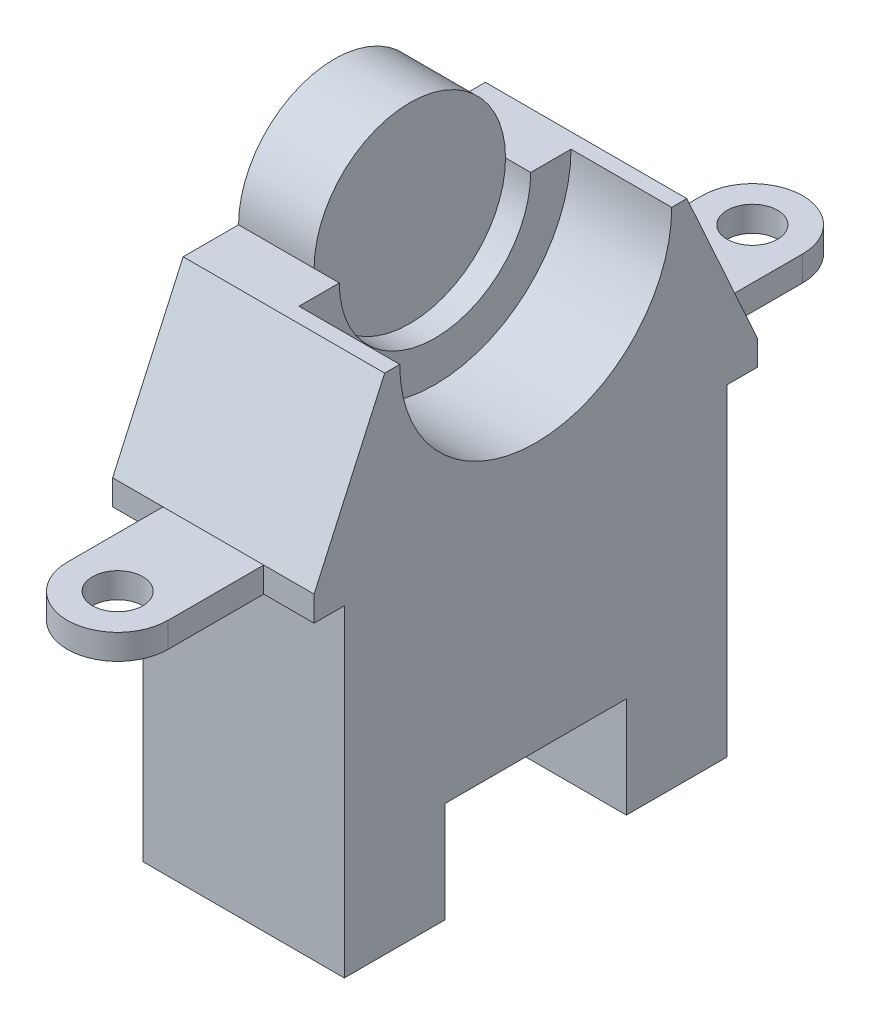
ISO-10303-21;
HEADER;
FILE_DESCRIPTION(('STEP AP214'),'2;1');
FILE_NAME('part.step','',(''),(''),'','','');
FILE_SCHEMA(('AUTOMOTIVE_DESIGN { 1 0 10303 214 1 1 1 1 }'));
ENDSEC;
DATA;
#1=APPLICATION_CONTEXT('core data for automotive mechanical design processes');
#2=APPLICATION_PROTOCOL_DEFINITION('international standard','automotive_design',2000,#1);
#3=PRODUCT_CONTEXT('',#1,'mechanical');
#4=PRODUCT('Part','Part','',(#3));
#5=PRODUCT_RELATED_PRODUCT_CATEGORY('part','',(#4));
#6=PRODUCT_DEFINITION_FORMATION('','',#4);
#7=PRODUCT_DEFINITION_CONTEXT('part definition',#1,'design');
#8=PRODUCT_DEFINITION('design','',#6,#7);
#9=PRODUCT_DEFINITION_SHAPE('','',#8);
#10=(LENGTH_UNIT() NAMED_UNIT(*) SI_UNIT(.MILLI.,.METRE.));
#11=(NAMED_UNIT(*) PLANE_ANGLE_UNIT() SI_UNIT($,.RADIAN.));
#12=(NAMED_UNIT(*) SI_UNIT($,.STERADIAN.) SOLID_ANGLE_UNIT());
#13=UNCERTAINTY_MEASURE_WITH_UNIT(LENGTH_MEASURE(1.E-05),#10,'distance_accuracy_value','');
#14=(GEOMETRIC_REPRESENTATION_CONTEXT(3) GLOBAL_UNCERTAINTY_ASSIGNED_CONTEXT((#13)) GLOBAL_UNIT_ASSIGNED_CONTEXT((#10,
#11,#12)) REPRESENTATION_CONTEXT('',''));
#15=CARTESIAN_POINT('',(0.,0.,0.));
#16=DIRECTION('',(0.,0.,1.));
#17=DIRECTION('',(1.,0.,0.));
#18=AXIS2_PLACEMENT_3D('',#15,#16,#17);
#19=CARTESIAN_POINT('',(20.,64.,44.));
#20=DIRECTION('',(0.,0.,-1.));
#21=DIRECTION('',(-1.,0.,0.));
#22=AXIS2_PLACEMENT_3D('',#19,#20,#21);
#23=PLANE('',#22);
#24=DIRECTION('',(0.,1.,0.));
#25=VECTOR('',#24,1.);
#26=CARTESIAN_POINT('',(10.,28.7721700923829,44.));
#27=LINE('',#26,#25);
#28=CARTESIAN_POINT('',(10.,64.,44.));
#29=VERTEX_POINT('',#28);
#30=CARTESIAN_POINT('',(10.,69.,44.));
#31=VERTEX_POINT('',#30);
#32=EDGE_CURVE('E761',#29,#31,#27,.T.);
#33=ORIENTED_EDGE('',*,*,#32,.F.);
#34=DIRECTION('',(-1.,0.,0.));
#35=VECTOR('',#34,1.);
#36=CARTESIAN_POINT('',(20.,64.,44.));
#37=LINE('',#36,#35);
#38=CARTESIAN_POINT('',(20.,64.,44.));
#39=VERTEX_POINT('',#38);
#40=EDGE_CURVE('E254',#39,#29,#37,.T.);
#41=ORIENTED_EDGE('',*,*,#40,.F.);
#42=DIRECTION('',(0.,-1.,0.));
#43=VECTOR('',#42,1.);
#44=CARTESIAN_POINT('',(20.,64.,44.));
#45=LINE('',#44,#43);
#46=CARTESIAN_POINT('',(20.,69.,44.));
#47=VERTEX_POINT('',#46);
#48=EDGE_CURVE('E400',#47,#39,#45,.T.);
#49=ORIENTED_EDGE('',*,*,#48,.F.);
#50=DIRECTION('',(-1.,0.,0.));
#51=VECTOR('',#50,1.);
#52=CARTESIAN_POINT('',(20.,69.,44.));
#53=LINE('',#52,#51);
#54=EDGE_CURVE('E266',#47,#31,#53,.T.);
#55=ORIENTED_EDGE('',*,*,#54,.T.);
#56=EDGE_LOOP('',(#33,#41,#49,#55));
#57=FACE_BOUND('',#56,.T.);
#58=ADVANCED_FACE('F45',(#57),#23,.F.);
#59=CARTESIAN_POINT('',(20.,64.,-44.));
#60=DIRECTION('',(0.,0.,1.));
#61=DIRECTION('',(1.,0.,0.));
#62=AXIS2_PLACEMENT_3D('',#59,#60,#61);
#63=PLANE('',#62);
#64=DIRECTION('',(0.,1.,0.));
#65=VECTOR('',#64,1.);
#66=CARTESIAN_POINT('',(-9.99999999999999,28.7721700923829,-44.));
#67=LINE('',#66,#65);
#68=CARTESIAN_POINT('',(-9.99999999999999,64.,-44.));
#69=VERTEX_POINT('',#68);
#70=CARTESIAN_POINT('',(-9.99999999999999,69.,-44.));
#71=VERTEX_POINT('',#70);
#72=EDGE_CURVE('E69',#69,#71,#67,.T.);
#73=ORIENTED_EDGE('',*,*,#72,.F.);
#74=DIRECTION('',(-1.,0.,0.));
#75=VECTOR('',#74,1.);
#76=CARTESIAN_POINT('',(20.,64.,-44.));
#77=LINE('',#76,#75);
#78=CARTESIAN_POINT('',(-20.,64.,-44.));
#79=VERTEX_POINT('',#78);
#80=EDGE_CURVE('E283',#69,#79,#77,.T.);
#81=ORIENTED_EDGE('',*,*,#80,.T.);
#82=DIRECTION('',(0.,1.,0.));
#83=VECTOR('',#82,1.);
#84=CARTESIAN_POINT('',(-20.,64.,-44.));
#85=LINE('',#84,#83);
#86=CARTESIAN_POINT('',(-20.,69.,-44.));
#87=VERTEX_POINT('',#86);
#88=EDGE_CURVE('E431',#79,#87,#85,.T.);
#89=ORIENTED_EDGE('',*,*,#88,.T.);
#90=DIRECTION('',(-1.,0.,0.));
#91=VECTOR('',#90,1.);
#92=CARTESIAN_POINT('',(20.,69.,-44.));
#93=LINE('',#92,#91);
#94=EDGE_CURVE('E278',#71,#87,#93,.T.);
#95=ORIENTED_EDGE('',*,*,#94,.F.);
#96=EDGE_LOOP('',(#73,#81,#89,#95));
#97=FACE_BOUND('',#96,.T.);
#98=ADVANCED_FACE('F504',(#97),#63,.F.);
#99=CARTESIAN_POINT('',(20.,100.,0.));
#100=DIRECTION('',(1.,0.,0.));
#101=DIRECTION('',(0.,0.,-1.));
#102=AXIS2_PLACEMENT_3D('',#99,#100,#101);
#103=CYLINDRICAL_SURFACE('',#102,19.);
#104=CARTESIAN_POINT('',(-5.,100.,0.));
#105=DIRECTION('',(-1.,0.,0.));
#106=DIRECTION('',(0.,0.,1.));
#107=AXIS2_PLACEMENT_3D('',#104,#105,#106);
#108=CIRCLE('',#107,19.);
#109=CARTESIAN_POINT('',(-5.,100.,19.));
#110=VERTEX_POINT('',#109);
#111=CARTESIAN_POINT('',(-5.,100.,-19.));
#112=VERTEX_POINT('',#111);
#113=EDGE_CURVE('E11',#110,#112,#108,.F.);
#114=ORIENTED_EDGE('',*,*,#113,.F.);
#115=DIRECTION('',(1.,0.,0.));
#116=VECTOR('',#115,1.);
#117=CARTESIAN_POINT('',(20.,100.,19.));
#118=LINE('',#117,#116);
#119=CARTESIAN_POINT('',(0.,100.,19.));
#120=VERTEX_POINT('',#119);
#121=EDGE_CURVE('E315',#120,#110,#118,.F.);
#122=ORIENTED_EDGE('',*,*,#121,.F.);
#123=CARTESIAN_POINT('',(0.,100.,0.));
#124=DIRECTION('',(1.,0.,0.));
#125=DIRECTION('',(0.,0.,-1.));
#126=AXIS2_PLACEMENT_3D('',#123,#124,#125);
#127=CIRCLE('',#126,19.);
#128=CARTESIAN_POINT('',(0.,100.,-19.));
#129=VERTEX_POINT('',#128);
#130=EDGE_CURVE('E344',#120,#129,#127,.T.);
#131=ORIENTED_EDGE('',*,*,#130,.T.);
#132=DIRECTION('',(1.,0.,0.));
#133=VECTOR('',#132,1.);
#134=CARTESIAN_POINT('',(20.,100.,-19.));
#135=LINE('',#134,#133);
#136=EDGE_CURVE('E325',#112,#129,#135,.T.);
#137=ORIENTED_EDGE('',*,*,#136,.F.);
#138=EDGE_LOOP('',(#114,#122,#131,#137));
#139=FACE_BOUND('',#138,.T.);
#140=ADVANCED_FACE('F349',(#139),#103,.F.);
#141=CARTESIAN_POINT('',(20.,100.,30.));
#142=DIRECTION('',(0.,-1.,0.));
#143=DIRECTION('',(0.,0.,-1.));
#144=AXIS2_PLACEMENT_3D('',#141,#142,#143);
#145=PLANE('',#144);
#146=DIRECTION('',(0.,0.,1.));
#147=VECTOR('',#146,1.);
#148=CARTESIAN_POINT('',(-20.,100.,30.));
#149=LINE('',#148,#147);
#150=CARTESIAN_POINT('',(-20.,100.,-30.));
#151=VERTEX_POINT('',#150);
#152=CARTESIAN_POINT('',(-20.,100.,-19.));
#153=VERTEX_POINT('',#152);
#154=EDGE_CURVE('E439',#151,#153,#149,.T.);
#155=ORIENTED_EDGE('',*,*,#154,.T.);
#156=EDGE_CURVE('E54',#153,#112,#135,.T.);
#157=ORIENTED_EDGE('',*,*,#156,.T.);
#158=ORIENTED_EDGE('',*,*,#136,.T.);
#159=DIRECTION('',(0.,0.,-1.));
#160=VECTOR('',#159,1.);
#161=CARTESIAN_POINT('',(0.,100.,30.));
#162=LINE('',#161,#160);
#163=CARTESIAN_POINT('',(0.,100.,-27.));
#164=VERTEX_POINT('',#163);
#165=EDGE_CURVE('E322',#129,#164,#162,.T.);
#166=ORIENTED_EDGE('',*,*,#165,.T.);
#167=DIRECTION('',(1.,0.,0.));
#168=VECTOR('',#167,1.);
#169=CARTESIAN_POINT('',(20.,100.,-27.));
#170=LINE('',#169,#168);
#171=CARTESIAN_POINT('',(20.,100.,-27.));
#172=VERTEX_POINT('',#171);
#173=EDGE_CURVE('E337',#164,#172,#170,.T.);
#174=ORIENTED_EDGE('',*,*,#173,.T.);
#175=DIRECTION('',(0.,0.,1.));
#176=VECTOR('',#175,1.);
#177=CARTESIAN_POINT('',(20.,100.,30.));
#178=LINE('',#177,#176);
#179=CARTESIAN_POINT('',(20.,100.,-30.));
#180=VERTEX_POINT('',#179);
#181=EDGE_CURVE('E394',#180,#172,#178,.T.);
#182=ORIENTED_EDGE('',*,*,#181,.F.);
#183=DIRECTION('',(-1.,0.,0.));
#184=VECTOR('',#183,1.);
#185=CARTESIAN_POINT('',(20.,100.,-30.));
#186=LINE('',#185,#184);
#187=EDGE_CURVE('E274',#180,#151,#186,.T.);
#188=ORIENTED_EDGE('',*,*,#187,.T.);
#189=EDGE_LOOP('',(#155,#157,#158,#166,#174,#182,#188));
#190=FACE_BOUND('',#189,.T.);
#191=ADVANCED_FACE('F335',(#190),#145,.F.);
#192=CARTESIAN_POINT('',(20.,0.,38.));
#193=DIRECTION('',(0.,1.,0.));
#194=DIRECTION('',(0.,0.,1.));
#195=AXIS2_PLACEMENT_3D('',#192,#193,#194);
#196=PLANE('',#195);
#197=DIRECTION('',(0.,0.,-1.));
#198=VECTOR('',#197,1.);
#199=CARTESIAN_POINT('',(-20.,0.,38.));
#200=LINE('',#199,#198);
#201=CARTESIAN_POINT('',(-20.,0.,38.));
#202=VERTEX_POINT('',#201);
#203=CARTESIAN_POINT('',(-20.,0.,18.));
#204=VERTEX_POINT('',#203);
#205=EDGE_CURVE('E363',#202,#204,#200,.T.);
#206=ORIENTED_EDGE('',*,*,#205,.T.);
#207=DIRECTION('',(-1.,0.,0.));
#208=VECTOR('',#207,1.);
#209=CARTESIAN_POINT('',(20.,0.,18.));
#210=LINE('',#209,#208);
#211=CARTESIAN_POINT('',(20.,0.,18.));
#212=VERTEX_POINT('',#211);
#213=EDGE_CURVE('E307',#212,#204,#210,.T.);
#214=ORIENTED_EDGE('',*,*,#213,.F.);
#215=DIRECTION('',(0.,0.,-1.));
#216=VECTOR('',#215,1.);
#217=CARTESIAN_POINT('',(20.,0.,38.));
#218=LINE('',#217,#216);
#219=CARTESIAN_POINT('',(20.,0.,38.));
#220=VERTEX_POINT('',#219);
#221=EDGE_CURVE('E364',#220,#212,#218,.T.);
#222=ORIENTED_EDGE('',*,*,#221,.F.);
#223=DIRECTION('',(-1.,0.,0.));
#224=VECTOR('',#223,1.);
#225=CARTESIAN_POINT('',(20.,0.,38.));
#226=LINE('',#225,#224);
#227=EDGE_CURVE('E262',#220,#202,#226,.T.);
#228=ORIENTED_EDGE('',*,*,#227,.T.);
#229=EDGE_LOOP('',(#206,#214,#222,#228));
#230=FACE_BOUND('',#229,.T.);
#231=ADVANCED_FACE('F47',(#230),#196,.F.);
#232=CARTESIAN_POINT('',(20.,0.,18.));
#233=DIRECTION('',(0.,0.,1.));
#234=DIRECTION('',(0.,-1.,0.));
#235=AXIS2_PLACEMENT_3D('',#232,#233,#234);
#236=PLANE('',#235);
#237=DIRECTION('',(0.,1.,0.));
#238=VECTOR('',#237,1.);
#239=CARTESIAN_POINT('',(-20.,0.,18.));
#240=LINE('',#239,#238);
#241=CARTESIAN_POINT('',(-20.,20.,18.));
#242=VERTEX_POINT('',#241);
#243=EDGE_CURVE('E412',#204,#242,#240,.T.);
#244=ORIENTED_EDGE('',*,*,#243,.T.);
#245=DIRECTION('',(-1.,0.,0.));
#246=VECTOR('',#245,1.);
#247=CARTESIAN_POINT('',(20.,20.,18.));
#248=LINE('',#247,#246);
#249=CARTESIAN_POINT('',(20.,20.,18.));
#250=VERTEX_POINT('',#249);
#251=EDGE_CURVE('E303',#250,#242,#248,.T.);
#252=ORIENTED_EDGE('',*,*,#251,.F.);
#253=DIRECTION('',(0.,1.,0.));
#254=VECTOR('',#253,1.);
#255=CARTESIAN_POINT('',(20.,0.,18.));
#256=LINE('',#255,#254);
#257=EDGE_CURVE('E368',#212,#250,#256,.T.);
#258=ORIENTED_EDGE('',*,*,#257,.F.);
#259=ORIENTED_EDGE('',*,*,#213,.T.);
#260=EDGE_LOOP('',(#244,#252,#258,#259));
#261=FACE_BOUND('',#260,.T.);
#262=ADVANCED_FACE('F469',(#261),#236,.F.);
#263=CARTESIAN_POINT('',(20.,20.,18.));
#264=DIRECTION('',(0.,1.,0.));
#265=DIRECTION('',(0.,0.,1.));
#266=AXIS2_PLACEMENT_3D('',#263,#264,#265);
#267=PLANE('',#266);
#268=DIRECTION('',(0.,0.,-1.));
#269=VECTOR('',#268,1.);
#270=CARTESIAN_POINT('',(-20.,20.,18.));
#271=LINE('',#270,#269);
#272=CARTESIAN_POINT('',(-20.,20.,-18.));
#273=VERTEX_POINT('',#272);
#274=EDGE_CURVE('E415',#242,#273,#271,.T.);
#275=ORIENTED_EDGE('',*,*,#274,.T.);
#276=DIRECTION('',(-1.,0.,0.));
#277=VECTOR('',#276,1.);
#278=CARTESIAN_POINT('',(20.,20.,-18.));
#279=LINE('',#278,#277);
#280=CARTESIAN_POINT('',(20.,20.,-18.));
#281=VERTEX_POINT('',#280);
#282=EDGE_CURVE('E299',#281,#273,#279,.T.);
#283=ORIENTED_EDGE('',*,*,#282,.F.);
#284=DIRECTION('',(0.,0.,-1.));
#285=VECTOR('',#284,1.);
#286=CARTESIAN_POINT('',(20.,20.,18.));
#287=LINE('',#286,#285);
#288=EDGE_CURVE('E372',#250,#281,#287,.T.);
#289=ORIENTED_EDGE('',*,*,#288,.F.);
#290=ORIENTED_EDGE('',*,*,#251,.T.);
#291=EDGE_LOOP('',(#275,#283,#289,#290));
#292=FACE_BOUND('',#291,.T.);
#293=ADVANCED_FACE('F547',(#292),#267,.F.);
#294=CARTESIAN_POINT('',(20.,20.,-18.));
#295=DIRECTION('',(0.,0.,-1.));
#296=DIRECTION('',(0.,1.,0.));
#297=AXIS2_PLACEMENT_3D('',#294,#295,#296);
#298=PLANE('',#297);
#299=DIRECTION('',(0.,-1.,0.));
#300=VECTOR('',#299,1.);
#301=CARTESIAN_POINT('',(-20.,20.,-18.));
#302=LINE('',#301,#300);
#303=CARTESIAN_POINT('',(-20.,0.,-18.));
#304=VERTEX_POINT('',#303);
#305=EDGE_CURVE('E418',#273,#304,#302,.T.);
#306=ORIENTED_EDGE('',*,*,#305,.T.);
#307=DIRECTION('',(-1.,0.,0.));
#308=VECTOR('',#307,1.);
#309=CARTESIAN_POINT('',(20.,0.,-18.));
#310=LINE('',#309,#308);
#311=CARTESIAN_POINT('',(20.,0.,-18.));
#312=VERTEX_POINT('',#311);
#313=EDGE_CURVE('E295',#312,#304,#310,.T.);
#314=ORIENTED_EDGE('',*,*,#313,.F.);
#315=DIRECTION('',(0.,-1.,0.));
#316=VECTOR('',#315,1.);
#317=CARTESIAN_POINT('',(20.,20.,-18.));
#318=LINE('',#317,#316);
#319=EDGE_CURVE('E375',#281,#312,#318,.T.);
#320=ORIENTED_EDGE('',*,*,#319,.F.);
#321=ORIENTED_EDGE('',*,*,#282,.T.);
#322=EDGE_LOOP('',(#306,#314,#320,#321));
#323=FACE_BOUND('',#322,.T.);
#324=ADVANCED_FACE('F543',(#323),#298,.F.);
#325=CARTESIAN_POINT('',(20.,0.,-18.));
#326=DIRECTION('',(0.,1.,0.));
#327=DIRECTION('',(0.,0.,1.));
#328=AXIS2_PLACEMENT_3D('',#325,#326,#327);
#329=PLANE('',#328);
#330=DIRECTION('',(0.,0.,-1.));
#331=VECTOR('',#330,1.);
#332=CARTESIAN_POINT('',(-20.,0.,-18.));
#333=LINE('',#332,#331);
#334=CARTESIAN_POINT('',(-20.,0.,-38.));
#335=VERTEX_POINT('',#334);
#336=EDGE_CURVE('E421',#304,#335,#333,.T.);
#337=ORIENTED_EDGE('',*,*,#336,.T.);
#338=DIRECTION('',(-1.,0.,0.));
#339=VECTOR('',#338,1.);
#340=CARTESIAN_POINT('',(20.,0.,-38.));
#341=LINE('',#340,#339);
#342=CARTESIAN_POINT('',(20.,0.,-38.));
#343=VERTEX_POINT('',#342);
#344=EDGE_CURVE('E291',#343,#335,#341,.T.);
#345=ORIENTED_EDGE('',*,*,#344,.F.);
#346=DIRECTION('',(0.,0.,-1.));
#347=VECTOR('',#346,1.);
#348=CARTESIAN_POINT('',(20.,0.,-18.));
#349=LINE('',#348,#347);
#350=EDGE_CURVE('E378',#312,#343,#349,.T.);
#351=ORIENTED_EDGE('',*,*,#350,.F.);
#352=ORIENTED_EDGE('',*,*,#313,.T.);
#353=EDGE_LOOP('',(#337,#345,#351,#352));
#354=FACE_BOUND('',#353,.T.);
#355=ADVANCED_FACE('F539',(#354),#329,.F.);
#356=CARTESIAN_POINT('',(20.,0.,-38.));
#357=DIRECTION('',(0.,0.,1.));
#358=DIRECTION('',(1.,0.,0.));
#359=AXIS2_PLACEMENT_3D('',#356,#357,#358);
#360=PLANE('',#359);
#361=DIRECTION('',(0.,1.,0.));
#362=VECTOR('',#361,1.);
#363=CARTESIAN_POINT('',(-20.,0.,-38.));
#364=LINE('',#363,#362);
#365=CARTESIAN_POINT('',(-20.,64.,-38.));
#366=VERTEX_POINT('',#365);
#367=EDGE_CURVE('E424',#335,#366,#364,.T.);
#368=ORIENTED_EDGE('',*,*,#367,.T.);
#369=DIRECTION('',(-1.,0.,0.));
#370=VECTOR('',#369,1.);
#371=CARTESIAN_POINT('',(20.,64.,-38.));
#372=LINE('',#371,#370);
#373=CARTESIAN_POINT('',(20.,64.,-38.));
#374=VERTEX_POINT('',#373);
#375=EDGE_CURVE('E287',#374,#366,#372,.T.);
#376=ORIENTED_EDGE('',*,*,#375,.F.);
#377=DIRECTION('',(0.,1.,0.));
#378=VECTOR('',#377,1.);
#379=CARTESIAN_POINT('',(20.,0.,-38.));
#380=LINE('',#379,#378);
#381=EDGE_CURVE('E381',#343,#374,#380,.T.);
#382=ORIENTED_EDGE('',*,*,#381,.F.);
#383=ORIENTED_EDGE('',*,*,#344,.T.);
#384=EDGE_LOOP('',(#368,#376,#382,#383));
#385=FACE_BOUND('',#384,.T.);
#386=ADVANCED_FACE('F535',(#385),#360,.F.);
#387=CARTESIAN_POINT('',(20.,64.,-38.));
#388=DIRECTION('',(0.,1.,0.));
#389=DIRECTION('',(0.,0.,1.));
#390=AXIS2_PLACEMENT_3D('',#387,#388,#389);
#391=PLANE('',#390);
#392=DIRECTION('',(0.,0.,-1.));
#393=VECTOR('',#392,1.);
#394=CARTESIAN_POINT('',(-20.,64.,-38.));
#395=LINE('',#394,#393);
#396=EDGE_CURVE('E427',#366,#79,#395,.T.);
#397=ORIENTED_EDGE('',*,*,#396,.T.);
#398=ORIENTED_EDGE('',*,*,#80,.F.);
#399=DIRECTION('',(0.,0.,-1.));
#400=VECTOR('',#399,1.);
#401=CARTESIAN_POINT('',(-10.,64.,-63.));
#402=LINE('',#401,#400);
#403=CARTESIAN_POINT('',(-10.,64.,-63.));
#404=VERTEX_POINT('',#403);
#405=EDGE_CURVE('E773',#69,#404,#402,.T.);
#406=ORIENTED_EDGE('',*,*,#405,.T.);
#407=CARTESIAN_POINT('',(0.,64.,-63.));
#408=DIRECTION('',(0.,1.,0.));
#409=DIRECTION('',(0.,0.,1.));
#410=AXIS2_PLACEMENT_3D('',#407,#408,#409);
#411=CIRCLE('',#410,10.);
#412=CARTESIAN_POINT('',(10.,64.,-63.));
#413=VERTEX_POINT('',#412);
#414=EDGE_CURVE('E777',#404,#413,#411,.F.);
#415=ORIENTED_EDGE('',*,*,#414,.T.);
#416=DIRECTION('',(0.,0.,1.));
#417=VECTOR('',#416,1.);
#418=CARTESIAN_POINT('',(10.,64.,-63.));
#419=LINE('',#418,#417);
#420=CARTESIAN_POINT('',(10.,64.,-44.));
#421=VERTEX_POINT('',#420);
#422=EDGE_CURVE('E778',#413,#421,#419,.T.);
#423=ORIENTED_EDGE('',*,*,#422,.T.);
#424=CARTESIAN_POINT('',(20.,64.,-44.));
#425=VERTEX_POINT('',#424);
#426=EDGE_CURVE('E284',#425,#421,#77,.T.);
#427=ORIENTED_EDGE('',*,*,#426,.F.);
#428=DIRECTION('',(0.,0.,-1.));
#429=VECTOR('',#428,1.);
#430=CARTESIAN_POINT('',(20.,64.,-38.));
#431=LINE('',#430,#429);
#432=EDGE_CURVE('E384',#374,#425,#431,.T.);
#433=ORIENTED_EDGE('',*,*,#432,.F.);
#434=ORIENTED_EDGE('',*,*,#375,.T.);
#435=EDGE_LOOP('',(#397,#398,#406,#415,#423,#427,#433,#434));
#436=FACE_BOUND('',#435,.T.);
#437=CARTESIAN_POINT('',(0.,64.,-63.));
#438=DIRECTION('',(0.,1.,0.));
#439=DIRECTION('',(0.,0.,1.));
#440=AXIS2_PLACEMENT_3D('',#437,#438,#439);
#441=CIRCLE('',#440,5.);
#442=CARTESIAN_POINT('',(0.,64.,-58.));
#443=VERTEX_POINT('',#442);
#444=EDGE_CURVE('E776',#443,#443,#441,.F.);
#445=ORIENTED_EDGE('',*,*,#444,.F.);
#446=EDGE_LOOP('',(#445));
#447=FACE_BOUND('',#446,.T.);
#448=ADVANCED_FACE('F531',(#436,#447),#391,.F.);
#449=ORIENTED_EDGE('',*,*,#426,.T.);
#450=DIRECTION('',(0.,1.,0.));
#451=VECTOR('',#450,1.);
#452=CARTESIAN_POINT('',(10.,28.7721700923829,-44.));
#453=LINE('',#452,#451);
#454=CARTESIAN_POINT('',(10.,69.,-44.));
#455=VERTEX_POINT('',#454);
#456=EDGE_CURVE('E807',#421,#455,#453,.T.);
#457=ORIENTED_EDGE('',*,*,#456,.T.);
#458=CARTESIAN_POINT('',(20.,69.,-44.));
#459=VERTEX_POINT('',#458);
#460=EDGE_CURVE('E279',#459,#455,#93,.T.);
#461=ORIENTED_EDGE('',*,*,#460,.F.);
#462=DIRECTION('',(0.,1.,0.));
#463=VECTOR('',#462,1.);
#464=CARTESIAN_POINT('',(20.,64.,-44.));
#465=LINE('',#464,#463);
#466=EDGE_CURVE('E387',#425,#459,#465,.T.);
#467=ORIENTED_EDGE('',*,*,#466,.F.);
#468=EDGE_LOOP('',(#449,#457,#461,#467));
#469=FACE_BOUND('',#468,.T.);
#470=ADVANCED_FACE('F513',(#469),#63,.F.);
#471=CARTESIAN_POINT('',(20.,69.,-44.));
#472=DIRECTION('',(0.,-0.411586722426498,0.911370599658675));
#473=DIRECTION('',(0.,-0.911370599658675,-0.411586722426498));
#474=AXIS2_PLACEMENT_3D('',#471,#472,#473);
#475=PLANE('',#474);
#476=DIRECTION('',(0.,0.911370599658675,0.411586722426498));
#477=VECTOR('',#476,1.);
#478=CARTESIAN_POINT('',(-20.,69.,-44.));
#479=LINE('',#478,#477);
#480=EDGE_CURVE('E435',#87,#151,#479,.T.);
#481=ORIENTED_EDGE('',*,*,#480,.T.);
#482=ORIENTED_EDGE('',*,*,#187,.F.);
#483=DIRECTION('',(0.,0.911370599658675,0.411586722426498));
#484=VECTOR('',#483,1.);
#485=CARTESIAN_POINT('',(20.,69.,-44.));
#486=LINE('',#485,#484);
#487=EDGE_CURVE('E390',#459,#180,#486,.T.);
#488=ORIENTED_EDGE('',*,*,#487,.F.);
#489=ORIENTED_EDGE('',*,*,#460,.T.);
#490=DIRECTION('',(1.,0.,0.));
#491=VECTOR('',#490,1.);
#492=CARTESIAN_POINT('',(10.,69.,-44.));
#493=LINE('',#492,#491);
#494=EDGE_CURVE('E796',#71,#455,#493,.T.);
#495=ORIENTED_EDGE('',*,*,#494,.F.);
#496=ORIENTED_EDGE('',*,*,#94,.T.);
#497=EDGE_LOOP('',(#481,#482,#488,#489,#495,#496));
#498=FACE_BOUND('',#497,.T.);
#499=ADVANCED_FACE('F524',(#498),#475,.F.);
#500=CARTESIAN_POINT('',(20.,100.,27.));
#501=VERTEX_POINT('',#500);
#502=CARTESIAN_POINT('',(20.,100.,30.));
#503=VERTEX_POINT('',#502);
#504=EDGE_CURVE('E393',#501,#503,#178,.T.);
#505=ORIENTED_EDGE('',*,*,#504,.F.);
#506=DIRECTION('',(1.,0.,0.));
#507=VECTOR('',#506,1.);
#508=CARTESIAN_POINT('',(20.,100.,27.));
#509=LINE('',#508,#507);
#510=CARTESIAN_POINT('',(0.,100.,27.));
#511=VERTEX_POINT('',#510);
#512=EDGE_CURVE('E351',#501,#511,#509,.F.);
#513=ORIENTED_EDGE('',*,*,#512,.T.);
#514=EDGE_CURVE('E319',#511,#120,#162,.T.);
#515=ORIENTED_EDGE('',*,*,#514,.T.);
#516=ORIENTED_EDGE('',*,*,#121,.T.);
#517=CARTESIAN_POINT('',(-20.,100.,19.));
#518=VERTEX_POINT('',#517);
#519=EDGE_CURVE('E314',#110,#518,#118,.F.);
#520=ORIENTED_EDGE('',*,*,#519,.T.);
#521=CARTESIAN_POINT('',(-20.,100.,30.));
#522=VERTEX_POINT('',#521);
#523=EDGE_CURVE('E438',#518,#522,#149,.T.);
#524=ORIENTED_EDGE('',*,*,#523,.T.);
#525=DIRECTION('',(-1.,0.,0.));
#526=VECTOR('',#525,1.);
#527=CARTESIAN_POINT('',(20.,100.,30.));
#528=LINE('',#527,#526);
#529=EDGE_CURVE('E270',#503,#522,#528,.T.);
#530=ORIENTED_EDGE('',*,*,#529,.F.);
#531=EDGE_LOOP('',(#505,#513,#515,#516,#520,#524,#530));
#532=FACE_BOUND('',#531,.T.);
#533=ADVANCED_FACE('F485',(#532),#145,.F.);
#534=CARTESIAN_POINT('',(20.,69.,44.));
#535=DIRECTION('',(0.,-0.411586722426498,-0.911370599658675));
#536=DIRECTION('',(0.,0.911370599658675,-0.411586722426498));
#537=AXIS2_PLACEMENT_3D('',#534,#535,#536);
#538=PLANE('',#537);
#539=DIRECTION('',(0.,-0.911370599658675,0.411586722426498));
#540=VECTOR('',#539,1.);
#541=CARTESIAN_POINT('',(-20.,69.,44.));
#542=LINE('',#541,#540);
#543=CARTESIAN_POINT('',(-20.,69.,44.));
#544=VERTEX_POINT('',#543);
#545=EDGE_CURVE('E442',#522,#544,#542,.T.);
#546=ORIENTED_EDGE('',*,*,#545,.T.);
#547=CARTESIAN_POINT('',(-9.99999999999999,69.,44.));
#548=VERTEX_POINT('',#547);
#549=EDGE_CURVE('E260',#548,#544,#53,.T.);
#550=ORIENTED_EDGE('',*,*,#549,.F.);
#551=DIRECTION('',(1.,0.,0.));
#552=VECTOR('',#551,1.);
#553=CARTESIAN_POINT('',(10.,69.,44.));
#554=LINE('',#553,#552);
#555=EDGE_CURVE('E61',#548,#31,#554,.T.);
#556=ORIENTED_EDGE('',*,*,#555,.T.);
#557=ORIENTED_EDGE('',*,*,#54,.F.);
#558=DIRECTION('',(0.,-0.911370599658675,0.411586722426498));
#559=VECTOR('',#558,1.);
#560=CARTESIAN_POINT('',(20.,69.,44.));
#561=LINE('',#560,#559);
#562=EDGE_CURVE('E397',#503,#47,#561,.T.);
#563=ORIENTED_EDGE('',*,*,#562,.F.);
#564=ORIENTED_EDGE('',*,*,#529,.T.);
#565=EDGE_LOOP('',(#546,#550,#556,#557,#563,#564));
#566=FACE_BOUND('',#565,.T.);
#567=ADVANCED_FACE('F479',(#566),#538,.F.);
#568=CARTESIAN_POINT('',(-9.99999999999999,64.,44.));
#569=VERTEX_POINT('',#568);
#570=CARTESIAN_POINT('',(-20.,64.,44.));
#571=VERTEX_POINT('',#570);
#572=EDGE_CURVE('E231',#569,#571,#37,.T.);
#573=ORIENTED_EDGE('',*,*,#572,.F.);
#574=DIRECTION('',(0.,1.,0.));
#575=VECTOR('',#574,1.);
#576=CARTESIAN_POINT('',(-9.99999999999999,28.7721700923829,44.));
#577=LINE('',#576,#575);
#578=EDGE_CURVE('E242',#569,#548,#577,.T.);
#579=ORIENTED_EDGE('',*,*,#578,.T.);
#580=ORIENTED_EDGE('',*,*,#549,.T.);
#581=DIRECTION('',(0.,-1.,0.));
#582=VECTOR('',#581,1.);
#583=CARTESIAN_POINT('',(-20.,64.,44.));
#584=LINE('',#583,#582);
#585=EDGE_CURVE('E251',#544,#571,#584,.T.);
#586=ORIENTED_EDGE('',*,*,#585,.T.);
#587=EDGE_LOOP('',(#573,#579,#580,#586));
#588=FACE_BOUND('',#587,.T.);
#589=ADVANCED_FACE('F249',(#588),#23,.F.);
#590=CARTESIAN_POINT('',(20.,64.,38.));
#591=DIRECTION('',(0.,1.,0.));
#592=DIRECTION('',(0.,0.,1.));
#593=AXIS2_PLACEMENT_3D('',#590,#591,#592);
#594=PLANE('',#593);
#595=DIRECTION('',(0.,0.,-1.));
#596=VECTOR('',#595,1.);
#597=CARTESIAN_POINT('',(-20.,64.,38.));
#598=LINE('',#597,#596);
#599=CARTESIAN_POINT('',(-20.,64.,38.));
#600=VERTEX_POINT('',#599);
#601=EDGE_CURVE('E448',#571,#600,#598,.T.);
#602=ORIENTED_EDGE('',*,*,#601,.T.);
#603=DIRECTION('',(-1.,0.,0.));
#604=VECTOR('',#603,1.);
#605=CARTESIAN_POINT('',(20.,64.,38.));
#606=LINE('',#605,#604);
#607=CARTESIAN_POINT('',(20.,64.,38.));
#608=VERTEX_POINT('',#607);
#609=EDGE_CURVE('E255',#608,#600,#606,.T.);
#610=ORIENTED_EDGE('',*,*,#609,.F.);
#611=DIRECTION('',(0.,0.,-1.));
#612=VECTOR('',#611,1.);
#613=CARTESIAN_POINT('',(20.,64.,38.));
#614=LINE('',#613,#612);
#615=EDGE_CURVE('E403',#39,#608,#614,.T.);
#616=ORIENTED_EDGE('',*,*,#615,.F.);
#617=ORIENTED_EDGE('',*,*,#40,.T.);
#618=DIRECTION('',(0.,0.,-1.));
#619=VECTOR('',#618,1.);
#620=CARTESIAN_POINT('',(10.,64.,63.));
#621=LINE('',#620,#619);
#622=CARTESIAN_POINT('',(10.,64.,63.));
#623=VERTEX_POINT('',#622);
#624=EDGE_CURVE('E765',#623,#29,#621,.T.);
#625=ORIENTED_EDGE('',*,*,#624,.F.);
#626=CARTESIAN_POINT('',(0.,64.,63.));
#627=DIRECTION('',(0.,1.,0.));
#628=DIRECTION('',(0.,0.,1.));
#629=AXIS2_PLACEMENT_3D('',#626,#627,#628);
#630=CIRCLE('',#629,10.);
#631=CARTESIAN_POINT('',(-10.,64.,63.));
#632=VERTEX_POINT('',#631);
#633=EDGE_CURVE('E234',#632,#623,#630,.T.);
#634=ORIENTED_EDGE('',*,*,#633,.F.);
#635=DIRECTION('',(0.,0.,1.));
#636=VECTOR('',#635,1.);
#637=CARTESIAN_POINT('',(-10.,64.,63.));
#638=LINE('',#637,#636);
#639=EDGE_CURVE('E226',#569,#632,#638,.T.);
#640=ORIENTED_EDGE('',*,*,#639,.F.);
#641=ORIENTED_EDGE('',*,*,#572,.T.);
#642=EDGE_LOOP('',(#602,#610,#616,#617,#625,#634,#640,#641));
#643=FACE_BOUND('',#642,.T.);
#644=CARTESIAN_POINT('',(0.,64.,63.));
#645=DIRECTION('',(0.,1.,0.));
#646=DIRECTION('',(0.,0.,1.));
#647=AXIS2_PLACEMENT_3D('',#644,#645,#646);
#648=CIRCLE('',#647,5.);
#649=CARTESIAN_POINT('',(0.,64.,68.));
#650=VERTEX_POINT('',#649);
#651=EDGE_CURVE('E746',#650,#650,#648,.T.);
#652=ORIENTED_EDGE('',*,*,#651,.T.);
#653=EDGE_LOOP('',(#652));
#654=FACE_BOUND('',#653,.T.);
#655=ADVANCED_FACE('F228',(#643,#654),#594,.F.);
#656=CARTESIAN_POINT('',(20.,0.,38.));
#657=DIRECTION('',(0.,0.,-1.));
#658=DIRECTION('',(-1.,0.,0.));
#659=AXIS2_PLACEMENT_3D('',#656,#657,#658);
#660=PLANE('',#659);
#661=DIRECTION('',(0.,-1.,0.));
#662=VECTOR('',#661,1.);
#663=CARTESIAN_POINT('',(-20.,0.,38.));
#664=LINE('',#663,#662);
#665=EDGE_CURVE('E369',#600,#202,#664,.T.);
#666=ORIENTED_EDGE('',*,*,#665,.T.);
#667=ORIENTED_EDGE('',*,*,#227,.F.);
#668=DIRECTION('',(0.,-1.,0.));
#669=VECTOR('',#668,1.);
#670=CARTESIAN_POINT('',(20.,0.,38.));
#671=LINE('',#670,#669);
#672=EDGE_CURVE('E406',#608,#220,#671,.T.);
#673=ORIENTED_EDGE('',*,*,#672,.F.);
#674=ORIENTED_EDGE('',*,*,#609,.T.);
#675=EDGE_LOOP('',(#666,#667,#673,#674));
#676=FACE_BOUND('',#675,.T.);
#677=ADVANCED_FACE('F476',(#676),#660,.F.);
#678=CARTESIAN_POINT('',(20.,0.,0.));
#679=DIRECTION('',(1.,0.,0.));
#680=DIRECTION('',(0.,0.,-1.));
#681=AXIS2_PLACEMENT_3D('',#678,#679,#680);
#682=PLANE('',#681);
#683=CARTESIAN_POINT('',(20.,100.,0.));
#684=DIRECTION('',(1.,0.,0.));
#685=DIRECTION('',(0.,0.,-1.));
#686=AXIS2_PLACEMENT_3D('',#683,#684,#685);
#687=CIRCLE('',#686,27.);
#688=EDGE_CURVE('E311',#501,#172,#687,.T.);
#689=ORIENTED_EDGE('',*,*,#688,.F.);
#690=ORIENTED_EDGE('',*,*,#504,.T.);
#691=ORIENTED_EDGE('',*,*,#562,.T.);
#692=ORIENTED_EDGE('',*,*,#48,.T.);
#693=ORIENTED_EDGE('',*,*,#615,.T.);
#694=ORIENTED_EDGE('',*,*,#672,.T.);
#695=ORIENTED_EDGE('',*,*,#221,.T.);
#696=ORIENTED_EDGE('',*,*,#257,.T.);
#697=ORIENTED_EDGE('',*,*,#288,.T.);
#698=ORIENTED_EDGE('',*,*,#319,.T.);
#699=ORIENTED_EDGE('',*,*,#350,.T.);
#700=ORIENTED_EDGE('',*,*,#381,.T.);
#701=ORIENTED_EDGE('',*,*,#432,.T.);
#702=ORIENTED_EDGE('',*,*,#466,.T.);
#703=ORIENTED_EDGE('',*,*,#487,.T.);
#704=ORIENTED_EDGE('',*,*,#181,.T.);
#705=EDGE_LOOP('',(#689,#690,#691,#692,#693,#694,#695,#696,#697,#698,#699,#700,#701,#702,#703,#704));
#706=FACE_BOUND('',#705,.T.);
#707=ADVANCED_FACE('F473',(#706),#682,.T.);
#708=CARTESIAN_POINT('',(-20.,0.,0.));
#709=DIRECTION('',(1.,0.,0.));
#710=DIRECTION('',(0.,0.,-1.));
#711=AXIS2_PLACEMENT_3D('',#708,#709,#710);
#712=PLANE('',#711);
#713=ORIENTED_EDGE('',*,*,#523,.F.);
#714=CARTESIAN_POINT('',(-20.,100.,0.));
#715=DIRECTION('',(-1.,0.,0.));
#716=DIRECTION('',(0.,0.,1.));
#717=AXIS2_PLACEMENT_3D('',#714,#715,#716);
#718=CIRCLE('',#717,19.);
#719=EDGE_CURVE('E817',#518,#153,#718,.T.);
#720=ORIENTED_EDGE('',*,*,#719,.T.);
#721=ORIENTED_EDGE('',*,*,#154,.F.);
#722=ORIENTED_EDGE('',*,*,#480,.F.);
#723=ORIENTED_EDGE('',*,*,#88,.F.);
#724=ORIENTED_EDGE('',*,*,#396,.F.);
#725=ORIENTED_EDGE('',*,*,#367,.F.);
#726=ORIENTED_EDGE('',*,*,#336,.F.);
#727=ORIENTED_EDGE('',*,*,#305,.F.);
#728=ORIENTED_EDGE('',*,*,#274,.F.);
#729=ORIENTED_EDGE('',*,*,#243,.F.);
#730=ORIENTED_EDGE('',*,*,#205,.F.);
#731=ORIENTED_EDGE('',*,*,#665,.F.);
#732=ORIENTED_EDGE('',*,*,#601,.F.);
#733=ORIENTED_EDGE('',*,*,#585,.F.);
#734=ORIENTED_EDGE('',*,*,#545,.F.);
#735=EDGE_LOOP('',(#713,#720,#721,#722,#723,#724,#725,#726,#727,#728,#729,#730,#731,#732,#733,#734));
#736=FACE_BOUND('',#735,.T.);
#737=ADVANCED_FACE('F464',(#736),#712,.F.);
#738=CARTESIAN_POINT('',(0.,119.,0.));
#739=DIRECTION('',(-1.,0.,0.));
#740=DIRECTION('',(0.,0.,1.));
#741=AXIS2_PLACEMENT_3D('',#738,#739,#740);
#742=PLANE('',#741);
#743=CARTESIAN_POINT('',(0.,100.,0.));
#744=DIRECTION('',(1.,0.,0.));
#745=DIRECTION('',(0.,0.,-1.));
#746=AXIS2_PLACEMENT_3D('',#743,#744,#745);
#747=CIRCLE('',#746,27.);
#748=EDGE_CURVE('E346',#511,#164,#747,.T.);
#749=ORIENTED_EDGE('',*,*,#748,.T.);
#750=ORIENTED_EDGE('',*,*,#165,.F.);
#751=ORIENTED_EDGE('',*,*,#130,.F.);
#752=ORIENTED_EDGE('',*,*,#514,.F.);
#753=EDGE_LOOP('',(#749,#750,#751,#752));
#754=FACE_BOUND('',#753,.T.);
#755=ADVANCED_FACE('F343',(#754),#742,.F.);
#756=CARTESIAN_POINT('',(20.,100.,0.));
#757=DIRECTION('',(1.,0.,0.));
#758=DIRECTION('',(0.,0.,-1.));
#759=AXIS2_PLACEMENT_3D('',#756,#757,#758);
#760=CYLINDRICAL_SURFACE('',#759,27.);
#761=ORIENTED_EDGE('',*,*,#748,.F.);
#762=ORIENTED_EDGE('',*,*,#512,.F.);
#763=ORIENTED_EDGE('',*,*,#688,.T.);
#764=ORIENTED_EDGE('',*,*,#173,.F.);
#765=EDGE_LOOP('',(#761,#762,#763,#764));
#766=FACE_BOUND('',#765,.T.);
#767=ADVANCED_FACE('F490',(#766),#760,.F.);
#768=CARTESIAN_POINT('',(-5.,100.,0.));
#769=DIRECTION('',(-1.,0.,0.));
#770=DIRECTION('',(0.,0.,1.));
#771=AXIS2_PLACEMENT_3D('',#768,#769,#770);
#772=CYLINDRICAL_SURFACE('',#771,19.);
#773=ORIENTED_EDGE('',*,*,#156,.F.);
#774=ORIENTED_EDGE('',*,*,#719,.F.);
#775=ORIENTED_EDGE('',*,*,#519,.F.);
#776=CARTESIAN_POINT('',(-5.,100.,0.));
#777=DIRECTION('',(-1.,0.,0.));
#778=DIRECTION('',(0.,0.,1.));
#779=AXIS2_PLACEMENT_3D('',#776,#777,#778);
#780=CIRCLE('',#779,19.);
#781=EDGE_CURVE('E357',#110,#112,#780,.T.);
#782=ORIENTED_EDGE('',*,*,#781,.T.);
#783=EDGE_LOOP('',(#773,#774,#775,#782));
#784=FACE_BOUND('',#783,.T.);
#785=ADVANCED_FACE('F492',(#784),#772,.T.);
#786=CARTESIAN_POINT('',(-5.,100.,0.));
#787=DIRECTION('',(-1.,0.,0.));
#788=DIRECTION('',(0.,0.,1.));
#789=AXIS2_PLACEMENT_3D('',#786,#787,#788);
#790=PLANE('',#789);
#791=ORIENTED_EDGE('',*,*,#781,.F.);
#792=ORIENTED_EDGE('',*,*,#113,.T.);
#793=EDGE_LOOP('',(#791,#792));
#794=FACE_BOUND('',#793,.T.);
#795=ADVANCED_FACE('F499',(#794),#790,.F.);
#796=CARTESIAN_POINT('',(-10.,28.7721700923829,-63.));
#797=DIRECTION('',(-1.,0.,0.));
#798=DIRECTION('',(0.,0.,1.));
#799=AXIS2_PLACEMENT_3D('',#796,#797,#798);
#800=PLANE('',#799);
#801=ORIENTED_EDGE('',*,*,#405,.F.);
#802=ORIENTED_EDGE('',*,*,#72,.T.);
#803=DIRECTION('',(0.,0.,1.));
#804=VECTOR('',#803,1.);
#805=CARTESIAN_POINT('',(-10.,69.,-63.));
#806=LINE('',#805,#804);
#807=CARTESIAN_POINT('',(-10.,69.,-63.));
#808=VERTEX_POINT('',#807);
#809=EDGE_CURVE('E792',#808,#71,#806,.T.);
#810=ORIENTED_EDGE('',*,*,#809,.F.);
#811=DIRECTION('',(0.,1.,0.));
#812=VECTOR('',#811,1.);
#813=CARTESIAN_POINT('',(-10.,28.7721700923829,-63.));
#814=LINE('',#813,#812);
#815=EDGE_CURVE('E804',#404,#808,#814,.T.);
#816=ORIENTED_EDGE('',*,*,#815,.F.);
#817=EDGE_LOOP('',(#801,#802,#810,#816));
#818=FACE_BOUND('',#817,.T.);
#819=ADVANCED_FACE('F619',(#818),#800,.T.);
#820=CARTESIAN_POINT('',(10.,28.7721700923829,-63.));
#821=DIRECTION('',(1.,0.,0.));
#822=DIRECTION('',(0.,0.,-1.));
#823=AXIS2_PLACEMENT_3D('',#820,#821,#822);
#824=PLANE('',#823);
#825=ORIENTED_EDGE('',*,*,#422,.F.);
#826=DIRECTION('',(0.,1.,0.));
#827=VECTOR('',#826,1.);
#828=CARTESIAN_POINT('',(10.,28.7721700923829,-63.));
#829=LINE('',#828,#827);
#830=CARTESIAN_POINT('',(10.,69.,-63.));
#831=VERTEX_POINT('',#830);
#832=EDGE_CURVE('E782',#413,#831,#829,.T.);
#833=ORIENTED_EDGE('',*,*,#832,.T.);
#834=DIRECTION('',(0.,0.,-1.));
#835=VECTOR('',#834,1.);
#836=CARTESIAN_POINT('',(10.,69.,-63.));
#837=LINE('',#836,#835);
#838=EDGE_CURVE('E800',#455,#831,#837,.T.);
#839=ORIENTED_EDGE('',*,*,#838,.F.);
#840=ORIENTED_EDGE('',*,*,#456,.F.);
#841=EDGE_LOOP('',(#825,#833,#839,#840));
#842=FACE_BOUND('',#841,.T.);
#843=ADVANCED_FACE('F643',(#842),#824,.T.);
#844=CARTESIAN_POINT('',(0.,28.7721700923829,-63.));
#845=DIRECTION('',(0.,1.,0.));
#846=DIRECTION('',(0.,0.,1.));
#847=AXIS2_PLACEMENT_3D('',#844,#845,#846);
#848=CYLINDRICAL_SURFACE('',#847,10.);
#849=ORIENTED_EDGE('',*,*,#414,.F.);
#850=ORIENTED_EDGE('',*,*,#815,.T.);
#851=CARTESIAN_POINT('',(0.,69.,-63.));
#852=DIRECTION('',(0.,1.,0.));
#853=DIRECTION('',(0.,0.,1.));
#854=AXIS2_PLACEMENT_3D('',#851,#852,#853);
#855=CIRCLE('',#854,10.);
#856=EDGE_CURVE('E788',#831,#808,#855,.T.);
#857=ORIENTED_EDGE('',*,*,#856,.F.);
#858=ORIENTED_EDGE('',*,*,#832,.F.);
#859=EDGE_LOOP('',(#849,#850,#857,#858));
#860=FACE_BOUND('',#859,.T.);
#861=ADVANCED_FACE('F653',(#860),#848,.T.);
#862=CARTESIAN_POINT('',(0.,69.,-63.));
#863=DIRECTION('',(0.,1.,0.));
#864=DIRECTION('',(0.,0.,1.));
#865=AXIS2_PLACEMENT_3D('',#862,#863,#864);
#866=PLANE('',#865);
#867=CARTESIAN_POINT('',(0.,69.,-63.));
#868=DIRECTION('',(0.,1.,0.));
#869=DIRECTION('',(0.,0.,1.));
#870=AXIS2_PLACEMENT_3D('',#867,#868,#869);
#871=CIRCLE('',#870,5.);
#872=CARTESIAN_POINT('',(0.,69.,-58.));
#873=VERTEX_POINT('',#872);
#874=EDGE_CURVE('E772',#873,#873,#871,.T.);
#875=ORIENTED_EDGE('',*,*,#874,.F.);
#876=EDGE_LOOP('',(#875));
#877=FACE_BOUND('',#876,.T.);
#878=ORIENTED_EDGE('',*,*,#856,.T.);
#879=ORIENTED_EDGE('',*,*,#809,.T.);
#880=ORIENTED_EDGE('',*,*,#494,.T.);
#881=ORIENTED_EDGE('',*,*,#838,.T.);
#882=EDGE_LOOP('',(#878,#879,#880,#881));
#883=FACE_BOUND('',#882,.T.);
#884=ADVANCED_FACE('F663',(#877,#883),#866,.T.);
#885=CARTESIAN_POINT('',(0.,28.7721700923829,-63.));
#886=DIRECTION('',(0.,1.,0.));
#887=DIRECTION('',(0.,0.,1.));
#888=AXIS2_PLACEMENT_3D('',#885,#886,#887);
#889=CYLINDRICAL_SURFACE('',#888,5.);
#890=ORIENTED_EDGE('',*,*,#444,.T.);
#891=EDGE_LOOP('',(#890));
#892=FACE_BOUND('',#891,.T.);
#893=ORIENTED_EDGE('',*,*,#874,.T.);
#894=EDGE_LOOP('',(#893));
#895=FACE_BOUND('',#894,.T.);
#896=ADVANCED_FACE('F673',(#892,#895),#889,.F.);
#897=CARTESIAN_POINT('',(0.,69.,63.));
#898=DIRECTION('',(0.,1.,0.));
#899=DIRECTION('',(0.,0.,-1.));
#900=AXIS2_PLACEMENT_3D('',#897,#898,#899);
#901=PLANE('',#900);
#902=CARTESIAN_POINT('',(0.,69.,63.));
#903=DIRECTION('',(0.,-1.,0.));
#904=DIRECTION('',(0.,0.,-1.));
#905=AXIS2_PLACEMENT_3D('',#902,#903,#904);
#906=CIRCLE('',#905,10.);
#907=CARTESIAN_POINT('',(10.,69.,63.));
#908=VERTEX_POINT('',#907);
#909=CARTESIAN_POINT('',(-10.,69.,63.));
#910=VERTEX_POINT('',#909);
#911=EDGE_CURVE('E239',#908,#910,#906,.T.);
#912=ORIENTED_EDGE('',*,*,#911,.F.);
#913=DIRECTION('',(0.,0.,1.));
#914=VECTOR('',#913,1.);
#915=CARTESIAN_POINT('',(10.,69.,63.));
#916=LINE('',#915,#914);
#917=EDGE_CURVE('E764',#31,#908,#916,.T.);
#918=ORIENTED_EDGE('',*,*,#917,.F.);
#919=ORIENTED_EDGE('',*,*,#555,.F.);
#920=DIRECTION('',(0.,0.,-1.));
#921=VECTOR('',#920,1.);
#922=CARTESIAN_POINT('',(-10.,69.,63.));
#923=LINE('',#922,#921);
#924=EDGE_CURVE('E244',#910,#548,#923,.T.);
#925=ORIENTED_EDGE('',*,*,#924,.F.);
#926=EDGE_LOOP('',(#912,#918,#919,#925));
#927=FACE_BOUND('',#926,.T.);
#928=CARTESIAN_POINT('',(0.,69.,63.));
#929=DIRECTION('',(0.,-1.,0.));
#930=DIRECTION('',(0.,0.,-1.));
#931=AXIS2_PLACEMENT_3D('',#928,#929,#930);
#932=CIRCLE('',#931,5.);
#933=CARTESIAN_POINT('',(0.,69.,58.));
#934=VERTEX_POINT('',#933);
#935=EDGE_CURVE('E749',#934,#934,#932,.T.);
#936=ORIENTED_EDGE('',*,*,#935,.T.);
#937=EDGE_LOOP('',(#936));
#938=FACE_BOUND('',#937,.T.);
#939=ADVANCED_FACE('F681',(#927,#938),#901,.T.);
#940=CARTESIAN_POINT('',(0.,28.7721700923829,63.));
#941=DIRECTION('',(0.,1.,0.));
#942=DIRECTION('',(0.,0.,1.));
#943=AXIS2_PLACEMENT_3D('',#940,#941,#942);
#944=CYLINDRICAL_SURFACE('',#943,10.);
#945=DIRECTION('',(0.,1.,0.));
#946=VECTOR('',#945,1.);
#947=CARTESIAN_POINT('',(-10.,28.7721700923829,63.));
#948=LINE('',#947,#946);
#949=EDGE_CURVE('E238',#632,#910,#948,.T.);
#950=ORIENTED_EDGE('',*,*,#949,.F.);
#951=ORIENTED_EDGE('',*,*,#633,.T.);
#952=DIRECTION('',(0.,1.,0.));
#953=VECTOR('',#952,1.);
#954=CARTESIAN_POINT('',(10.,28.7721700923829,63.));
#955=LINE('',#954,#953);
#956=EDGE_CURVE('E754',#623,#908,#955,.T.);
#957=ORIENTED_EDGE('',*,*,#956,.T.);
#958=ORIENTED_EDGE('',*,*,#911,.T.);
#959=EDGE_LOOP('',(#950,#951,#957,#958));
#960=FACE_BOUND('',#959,.T.);
#961=ADVANCED_FACE('F703',(#960),#944,.T.);
#962=CARTESIAN_POINT('',(-10.,28.7721700923829,63.));
#963=DIRECTION('',(1.,0.,0.));
#964=DIRECTION('',(0.,0.,-1.));
#965=AXIS2_PLACEMENT_3D('',#962,#963,#964);
#966=PLANE('',#965);
#967=ORIENTED_EDGE('',*,*,#578,.F.);
#968=ORIENTED_EDGE('',*,*,#639,.T.);
#969=ORIENTED_EDGE('',*,*,#949,.T.);
#970=ORIENTED_EDGE('',*,*,#924,.T.);
#971=EDGE_LOOP('',(#967,#968,#969,#970));
#972=FACE_BOUND('',#971,.T.);
#973=ADVANCED_FACE('F243',(#972),#966,.F.);
#974=CARTESIAN_POINT('',(10.,28.7721700923829,63.));
#975=DIRECTION('',(-1.,0.,0.));
#976=DIRECTION('',(0.,0.,1.));
#977=AXIS2_PLACEMENT_3D('',#974,#975,#976);
#978=PLANE('',#977);
#979=ORIENTED_EDGE('',*,*,#956,.F.);
#980=ORIENTED_EDGE('',*,*,#624,.T.);
#981=ORIENTED_EDGE('',*,*,#32,.T.);
#982=ORIENTED_EDGE('',*,*,#917,.T.);
#983=EDGE_LOOP('',(#979,#980,#981,#982));
#984=FACE_BOUND('',#983,.T.);
#985=ADVANCED_FACE('F721',(#984),#978,.F.);
#986=CARTESIAN_POINT('',(0.,28.7721700923829,63.));
#987=DIRECTION('',(0.,1.,0.));
#988=DIRECTION('',(0.,0.,1.));
#989=AXIS2_PLACEMENT_3D('',#986,#987,#988);
#990=CYLINDRICAL_SURFACE('',#989,5.);
#991=ORIENTED_EDGE('',*,*,#651,.F.);
#992=EDGE_LOOP('',(#991));
#993=FACE_BOUND('',#992,.T.);
#994=ORIENTED_EDGE('',*,*,#935,.F.);
#995=EDGE_LOOP('',(#994));
#996=FACE_BOUND('',#995,.T.);
#997=ADVANCED_FACE('F730',(#993,#996),#990,.F.);
#998=CLOSED_SHELL('',(#58,#98,#140,#191,#231,#262,#293,#324,#355,#386,#448,#470,#499,#533,#567,
#589,#655,#677,#707,#737,#755,#767,#785,#795,#819,#843,#861,#884,#896,#939,#961,#973,#985,#997));
#999=MANIFOLD_SOLID_BREP('B2',#998);
#1000=ADVANCED_BREP_SHAPE_REPRESENTATION('',(#18,#999),#14);
#1001=SHAPE_DEFINITION_REPRESENTATION(#9,#1000);
ENDSEC;
END-ISO-10303-21;
